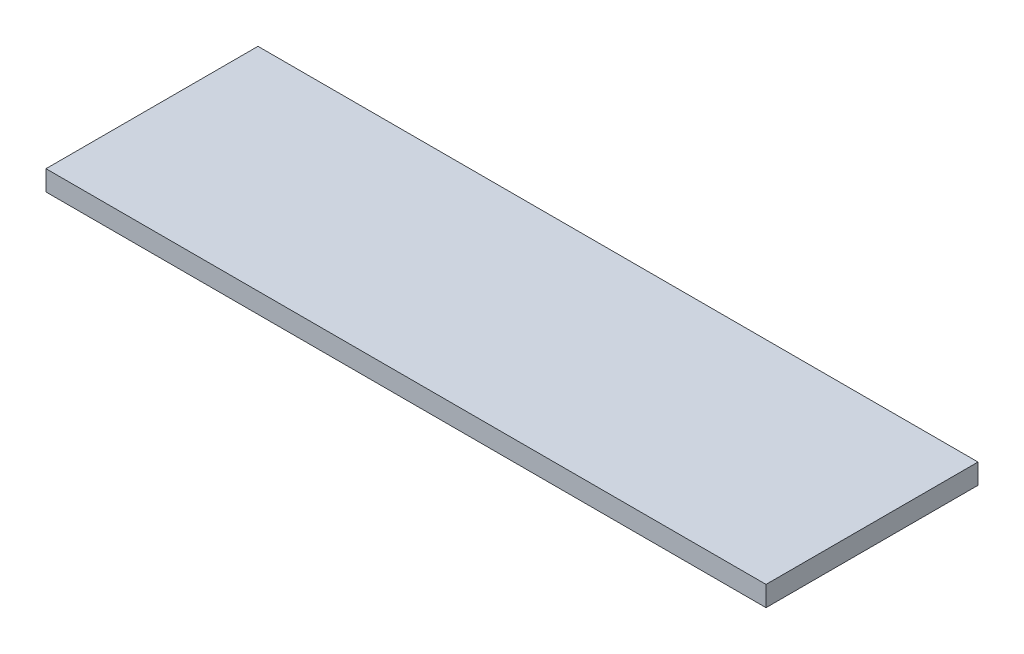
ISO-10303-21;
HEADER;
FILE_DESCRIPTION(('STEP AP214'),'2;1');
FILE_NAME('part.step','',(''),(''),'','','');
FILE_SCHEMA(('AUTOMOTIVE_DESIGN { 1 0 10303 214 1 1 1 1 }'));
ENDSEC;
DATA;
#1=APPLICATION_CONTEXT('core data for automotive mechanical design processes');
#2=APPLICATION_PROTOCOL_DEFINITION('international standard','automotive_design',2000,#1);
#3=PRODUCT_CONTEXT('',#1,'mechanical');
#4=PRODUCT('Part','Part','',(#3));
#5=PRODUCT_RELATED_PRODUCT_CATEGORY('part','',(#4));
#6=PRODUCT_DEFINITION_FORMATION('','',#4);
#7=PRODUCT_DEFINITION_CONTEXT('part definition',#1,'design');
#8=PRODUCT_DEFINITION('design','',#6,#7);
#9=PRODUCT_DEFINITION_SHAPE('','',#8);
#10=(LENGTH_UNIT() NAMED_UNIT(*) SI_UNIT(.MILLI.,.METRE.));
#11=(NAMED_UNIT(*) PLANE_ANGLE_UNIT() SI_UNIT($,.RADIAN.));
#12=(NAMED_UNIT(*) SI_UNIT($,.STERADIAN.) SOLID_ANGLE_UNIT());
#13=UNCERTAINTY_MEASURE_WITH_UNIT(LENGTH_MEASURE(1.E-05),#10,'distance_accuracy_value','');
#14=(GEOMETRIC_REPRESENTATION_CONTEXT(3) GLOBAL_UNCERTAINTY_ASSIGNED_CONTEXT((#13)) GLOBAL_UNIT_ASSIGNED_CONTEXT((#10,
#11,#12)) REPRESENTATION_CONTEXT('',''));
#15=CARTESIAN_POINT('',(0.,0.,0.));
#16=DIRECTION('',(0.,0.,1.));
#17=DIRECTION('',(1.,0.,0.));
#18=AXIS2_PLACEMENT_3D('',#15,#16,#17);
#19=CARTESIAN_POINT('',(0.,3.,31.5));
#20=DIRECTION('',(1.,0.,0.));
#21=DIRECTION('',(0.,0.,-1.));
#22=AXIS2_PLACEMENT_3D('',#19,#20,#21);
#23=PLANE('',#22);
#24=DIRECTION('',(0.,0.,1.));
#25=VECTOR('',#24,1.);
#26=CARTESIAN_POINT('',(0.,0.,31.5));
#27=LINE('',#26,#25);
#28=CARTESIAN_POINT('',(0.,0.,0.));
#29=VERTEX_POINT('',#28);
#30=CARTESIAN_POINT('',(0.,0.,31.5));
#31=VERTEX_POINT('',#30);
#32=EDGE_CURVE('E104',#29,#31,#27,.T.);
#33=ORIENTED_EDGE('',*,*,#32,.T.);
#34=DIRECTION('',(0.,-1.,0.));
#35=VECTOR('',#34,1.);
#36=CARTESIAN_POINT('',(0.,3.,31.5));
#37=LINE('',#36,#35);
#38=CARTESIAN_POINT('',(0.,3.,31.5));
#39=VERTEX_POINT('',#38);
#40=EDGE_CURVE('E11',#39,#31,#37,.T.);
#41=ORIENTED_EDGE('',*,*,#40,.F.);
#42=DIRECTION('',(0.,0.,1.));
#43=VECTOR('',#42,1.);
#44=CARTESIAN_POINT('',(0.,3.,31.5));
#45=LINE('',#44,#43);
#46=CARTESIAN_POINT('',(0.,3.,0.));
#47=VERTEX_POINT('',#46);
#48=EDGE_CURVE('E92',#47,#39,#45,.T.);
#49=ORIENTED_EDGE('',*,*,#48,.F.);
#50=DIRECTION('',(0.,-1.,0.));
#51=VECTOR('',#50,1.);
#52=CARTESIAN_POINT('',(0.,3.,0.));
#53=LINE('',#52,#51);
#54=EDGE_CURVE('E100',#47,#29,#53,.T.);
#55=ORIENTED_EDGE('',*,*,#54,.T.);
#56=EDGE_LOOP('',(#33,#41,#49,#55));
#57=FACE_BOUND('',#56,.T.);
#58=ADVANCED_FACE('F41',(#57),#23,.F.);
#59=CARTESIAN_POINT('',(0.,3.,31.5));
#60=DIRECTION('',(0.,0.,-1.));
#61=DIRECTION('',(-1.,0.,0.));
#62=AXIS2_PLACEMENT_3D('',#59,#60,#61);
#63=PLANE('',#62);
#64=DIRECTION('',(1.,0.,0.));
#65=VECTOR('',#64,1.);
#66=CARTESIAN_POINT('',(0.,0.,31.5));
#67=LINE('',#66,#65);
#68=CARTESIAN_POINT('',(107.,0.,31.5));
#69=VERTEX_POINT('',#68);
#70=EDGE_CURVE('E96',#31,#69,#67,.T.);
#71=ORIENTED_EDGE('',*,*,#70,.T.);
#72=DIRECTION('',(0.,-1.,0.));
#73=VECTOR('',#72,1.);
#74=CARTESIAN_POINT('',(107.,3.,31.5));
#75=LINE('',#74,#73);
#76=CARTESIAN_POINT('',(107.,3.,31.5));
#77=VERTEX_POINT('',#76);
#78=EDGE_CURVE('E49',#77,#69,#75,.T.);
#79=ORIENTED_EDGE('',*,*,#78,.F.);
#80=DIRECTION('',(1.,0.,0.));
#81=VECTOR('',#80,1.);
#82=CARTESIAN_POINT('',(0.,3.,31.5));
#83=LINE('',#82,#81);
#84=EDGE_CURVE('E87',#39,#77,#83,.T.);
#85=ORIENTED_EDGE('',*,*,#84,.F.);
#86=ORIENTED_EDGE('',*,*,#40,.T.);
#87=EDGE_LOOP('',(#71,#79,#85,#86));
#88=FACE_BOUND('',#87,.T.);
#89=ADVANCED_FACE('F95',(#88),#63,.F.);
#90=CARTESIAN_POINT('',(107.,3.,31.5));
#91=DIRECTION('',(-1.,0.,0.));
#92=DIRECTION('',(0.,0.,1.));
#93=AXIS2_PLACEMENT_3D('',#90,#91,#92);
#94=PLANE('',#93);
#95=DIRECTION('',(0.,0.,-1.));
#96=VECTOR('',#95,1.);
#97=CARTESIAN_POINT('',(107.,0.,31.5));
#98=LINE('',#97,#96);
#99=CARTESIAN_POINT('',(107.,0.,0.));
#100=VERTEX_POINT('',#99);
#101=EDGE_CURVE('E74',#69,#100,#98,.T.);
#102=ORIENTED_EDGE('',*,*,#101,.T.);
#103=DIRECTION('',(0.,-1.,0.));
#104=VECTOR('',#103,1.);
#105=CARTESIAN_POINT('',(107.,3.,0.));
#106=LINE('',#105,#104);
#107=CARTESIAN_POINT('',(107.,3.,0.));
#108=VERTEX_POINT('',#107);
#109=EDGE_CURVE('E97',#108,#100,#106,.T.);
#110=ORIENTED_EDGE('',*,*,#109,.F.);
#111=DIRECTION('',(0.,0.,-1.));
#112=VECTOR('',#111,1.);
#113=CARTESIAN_POINT('',(107.,3.,31.5));
#114=LINE('',#113,#112);
#115=EDGE_CURVE('E90',#77,#108,#114,.T.);
#116=ORIENTED_EDGE('',*,*,#115,.F.);
#117=ORIENTED_EDGE('',*,*,#78,.T.);
#118=EDGE_LOOP('',(#102,#110,#116,#117));
#119=FACE_BOUND('',#118,.T.);
#120=ADVANCED_FACE('F98',(#119),#94,.F.);
#121=CARTESIAN_POINT('',(0.,3.,0.));
#122=DIRECTION('',(0.,0.,1.));
#123=DIRECTION('',(1.,0.,0.));
#124=AXIS2_PLACEMENT_3D('',#121,#122,#123);
#125=PLANE('',#124);
#126=DIRECTION('',(-1.,0.,0.));
#127=VECTOR('',#126,1.);
#128=CARTESIAN_POINT('',(0.,0.,0.));
#129=LINE('',#128,#127);
#130=EDGE_CURVE('E80',#100,#29,#129,.T.);
#131=ORIENTED_EDGE('',*,*,#130,.T.);
#132=ORIENTED_EDGE('',*,*,#54,.F.);
#133=DIRECTION('',(-1.,0.,0.));
#134=VECTOR('',#133,1.);
#135=CARTESIAN_POINT('',(0.,3.,0.));
#136=LINE('',#135,#134);
#137=EDGE_CURVE('E57',#108,#47,#136,.T.);
#138=ORIENTED_EDGE('',*,*,#137,.F.);
#139=ORIENTED_EDGE('',*,*,#109,.T.);
#140=EDGE_LOOP('',(#131,#132,#138,#139));
#141=FACE_BOUND('',#140,.T.);
#142=ADVANCED_FACE('F111',(#141),#125,.F.);
#143=CARTESIAN_POINT('',(0.,3.,0.));
#144=DIRECTION('',(0.,-1.,0.));
#145=DIRECTION('',(0.,0.,-1.));
#146=AXIS2_PLACEMENT_3D('',#143,#144,#145);
#147=PLANE('',#146);
#148=ORIENTED_EDGE('',*,*,#48,.T.);
#149=ORIENTED_EDGE('',*,*,#84,.T.);
#150=ORIENTED_EDGE('',*,*,#115,.T.);
#151=ORIENTED_EDGE('',*,*,#137,.T.);
#152=EDGE_LOOP('',(#148,#149,#150,#151));
#153=FACE_BOUND('',#152,.T.);
#154=ADVANCED_FACE('F88',(#153),#147,.F.);
#155=CARTESIAN_POINT('',(0.,0.,0.));
#156=DIRECTION('',(0.,-1.,0.));
#157=DIRECTION('',(0.,0.,-1.));
#158=AXIS2_PLACEMENT_3D('',#155,#156,#157);
#159=PLANE('',#158);
#160=ORIENTED_EDGE('',*,*,#32,.F.);
#161=ORIENTED_EDGE('',*,*,#130,.F.);
#162=ORIENTED_EDGE('',*,*,#101,.F.);
#163=ORIENTED_EDGE('',*,*,#70,.F.);
#164=EDGE_LOOP('',(#160,#161,#162,#163));
#165=FACE_BOUND('',#164,.T.);
#166=ADVANCED_FACE('F114',(#165),#159,.T.);
#167=CLOSED_SHELL('',(#58,#89,#120,#142,#154,#166));
#168=MANIFOLD_SOLID_BREP('B2',#167);
#169=ADVANCED_BREP_SHAPE_REPRESENTATION('',(#18,#168),#14);
#170=SHAPE_DEFINITION_REPRESENTATION(#9,#169);
ENDSEC;
END-ISO-10303-21;
